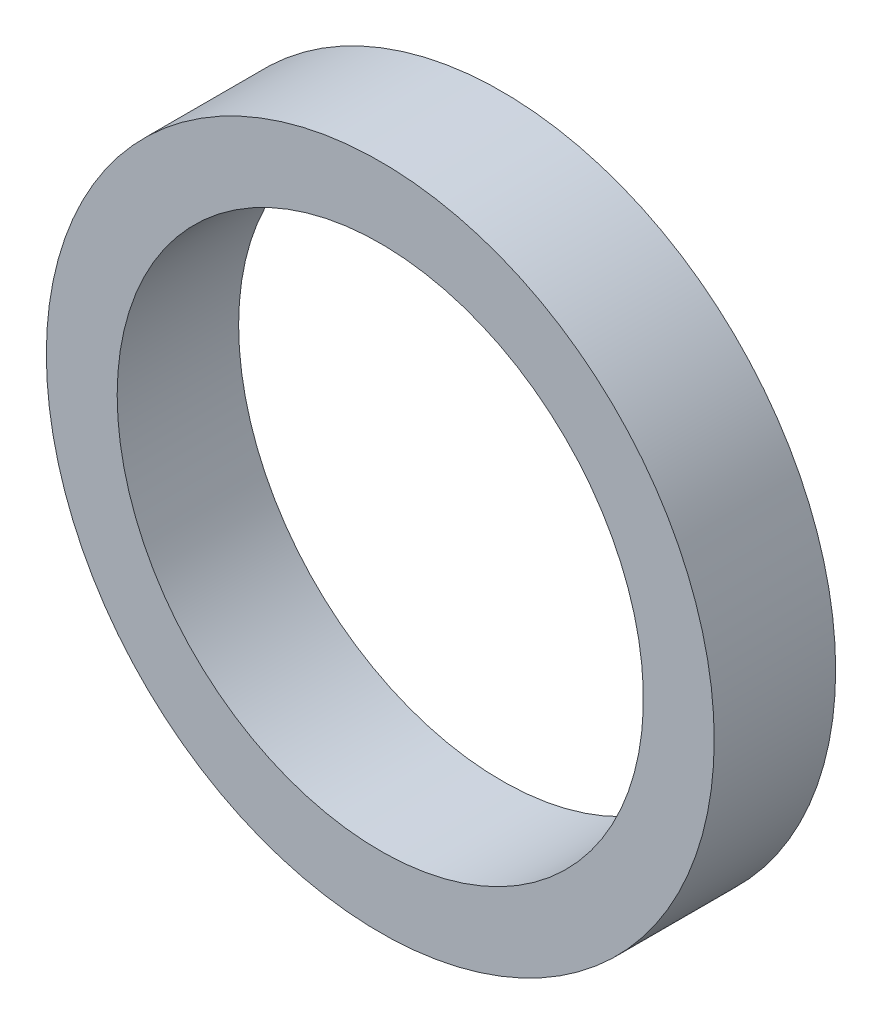
ISO-10303-21;
HEADER;
FILE_DESCRIPTION(('STEP AP214'),'2;1');
FILE_NAME('part.step','',(''),(''),'','','');
FILE_SCHEMA(('AUTOMOTIVE_DESIGN { 1 0 10303 214 1 1 1 1 }'));
ENDSEC;
DATA;
#1=APPLICATION_CONTEXT('core data for automotive mechanical design processes');
#2=APPLICATION_PROTOCOL_DEFINITION('international standard','automotive_design',2000,#1);
#3=PRODUCT_CONTEXT('',#1,'mechanical');
#4=PRODUCT('Part','Part','',(#3));
#5=PRODUCT_RELATED_PRODUCT_CATEGORY('part','',(#4));
#6=PRODUCT_DEFINITION_FORMATION('','',#4);
#7=PRODUCT_DEFINITION_CONTEXT('part definition',#1,'design');
#8=PRODUCT_DEFINITION('design','',#6,#7);
#9=PRODUCT_DEFINITION_SHAPE('','',#8);
#10=(LENGTH_UNIT() NAMED_UNIT(*) SI_UNIT(.MILLI.,.METRE.));
#11=(NAMED_UNIT(*) PLANE_ANGLE_UNIT() SI_UNIT($,.RADIAN.));
#12=(NAMED_UNIT(*) SI_UNIT($,.STERADIAN.) SOLID_ANGLE_UNIT());
#13=UNCERTAINTY_MEASURE_WITH_UNIT(LENGTH_MEASURE(1.E-05),#10,'distance_accuracy_value','');
#14=(GEOMETRIC_REPRESENTATION_CONTEXT(3) GLOBAL_UNCERTAINTY_ASSIGNED_CONTEXT((#13)) GLOBAL_UNIT_ASSIGNED_CONTEXT((#10,
#11,#12)) REPRESENTATION_CONTEXT('',''));
#15=CARTESIAN_POINT('',(0.,0.,0.));
#16=DIRECTION('',(0.,0.,1.));
#17=DIRECTION('',(1.,0.,0.));
#18=AXIS2_PLACEMENT_3D('',#15,#16,#17);
#19=CARTESIAN_POINT('',(0.,0.,-72.6195652173913));
#20=DIRECTION('',(0.,0.,-1.));
#21=DIRECTION('',(-1.,0.,0.));
#22=AXIS2_PLACEMENT_3D('',#19,#20,#21);
#23=CYLINDRICAL_SURFACE('',#22,65.);
#24=CARTESIAN_POINT('',(0.,0.,-15.));
#25=DIRECTION('',(0.,0.,-1.));
#26=DIRECTION('',(-1.,0.,0.));
#27=AXIS2_PLACEMENT_3D('',#24,#25,#26);
#28=CIRCLE('',#27,65.);
#29=CARTESIAN_POINT('',(-65.,0.,-15.));
#30=VERTEX_POINT('',#29);
#31=EDGE_CURVE('E10',#30,#30,#28,.T.);
#32=ORIENTED_EDGE('',*,*,#31,.T.);
#33=EDGE_LOOP('',(#32));
#34=FACE_BOUND('',#33,.T.);
#35=CARTESIAN_POINT('',(0.,0.,15.));
#36=DIRECTION('',(0.,0.,-1.));
#37=DIRECTION('',(-1.,0.,0.));
#38=AXIS2_PLACEMENT_3D('',#35,#36,#37);
#39=CIRCLE('',#38,65.);
#40=CARTESIAN_POINT('',(-65.,0.,15.));
#41=VERTEX_POINT('',#40);
#42=EDGE_CURVE('E46',#41,#41,#39,.T.);
#43=ORIENTED_EDGE('',*,*,#42,.F.);
#44=EDGE_LOOP('',(#43));
#45=FACE_BOUND('',#44,.T.);
#46=ADVANCED_FACE('F32',(#34,#45),#23,.F.);
#47=CARTESIAN_POINT('',(-82.5,0.,-15.));
#48=DIRECTION('',(0.,0.,-1.));
#49=DIRECTION('',(-1.,0.,0.));
#50=AXIS2_PLACEMENT_3D('',#47,#48,#49);
#51=PLANE('',#50);
#52=CARTESIAN_POINT('',(0.,0.,-15.));
#53=DIRECTION('',(0.,0.,-1.));
#54=DIRECTION('',(-1.,0.,0.));
#55=AXIS2_PLACEMENT_3D('',#52,#53,#54);
#56=CIRCLE('',#55,82.5);
#57=CARTESIAN_POINT('',(-82.5,0.,-15.));
#58=VERTEX_POINT('',#57);
#59=EDGE_CURVE('E38',#58,#58,#56,.T.);
#60=ORIENTED_EDGE('',*,*,#59,.T.);
#61=EDGE_LOOP('',(#60));
#62=FACE_BOUND('',#61,.T.);
#63=ORIENTED_EDGE('',*,*,#31,.F.);
#64=EDGE_LOOP('',(#63));
#65=FACE_BOUND('',#64,.T.);
#66=ADVANCED_FACE('F56',(#62,#65),#51,.T.);
#67=CARTESIAN_POINT('',(0.,0.,-72.6195652173913));
#68=DIRECTION('',(0.,0.,-1.));
#69=DIRECTION('',(-1.,0.,0.));
#70=AXIS2_PLACEMENT_3D('',#67,#68,#69);
#71=CYLINDRICAL_SURFACE('',#70,82.5);
#72=CARTESIAN_POINT('',(0.,0.,15.));
#73=DIRECTION('',(0.,0.,-1.));
#74=DIRECTION('',(-1.,0.,0.));
#75=AXIS2_PLACEMENT_3D('',#72,#73,#74);
#76=CIRCLE('',#75,82.5);
#77=CARTESIAN_POINT('',(-82.5,0.,15.));
#78=VERTEX_POINT('',#77);
#79=EDGE_CURVE('E42',#78,#78,#76,.T.);
#80=ORIENTED_EDGE('',*,*,#79,.T.);
#81=EDGE_LOOP('',(#80));
#82=FACE_BOUND('',#81,.T.);
#83=ORIENTED_EDGE('',*,*,#59,.F.);
#84=EDGE_LOOP('',(#83));
#85=FACE_BOUND('',#84,.T.);
#86=ADVANCED_FACE('F60',(#82,#85),#71,.T.);
#87=CARTESIAN_POINT('',(-82.5,0.,15.));
#88=DIRECTION('',(0.,0.,1.));
#89=DIRECTION('',(1.,0.,0.));
#90=AXIS2_PLACEMENT_3D('',#87,#88,#89);
#91=PLANE('',#90);
#92=ORIENTED_EDGE('',*,*,#42,.T.);
#93=EDGE_LOOP('',(#92));
#94=FACE_BOUND('',#93,.T.);
#95=ORIENTED_EDGE('',*,*,#79,.F.);
#96=EDGE_LOOP('',(#95));
#97=FACE_BOUND('',#96,.T.);
#98=ADVANCED_FACE('F52',(#94,#97),#91,.T.);
#99=CLOSED_SHELL('',(#46,#66,#86,#98));
#100=MANIFOLD_SOLID_BREP('B2',#99);
#101=ADVANCED_BREP_SHAPE_REPRESENTATION('',(#18,#100),#14);
#102=SHAPE_DEFINITION_REPRESENTATION(#9,#101);
ENDSEC;
END-ISO-10303-21;
